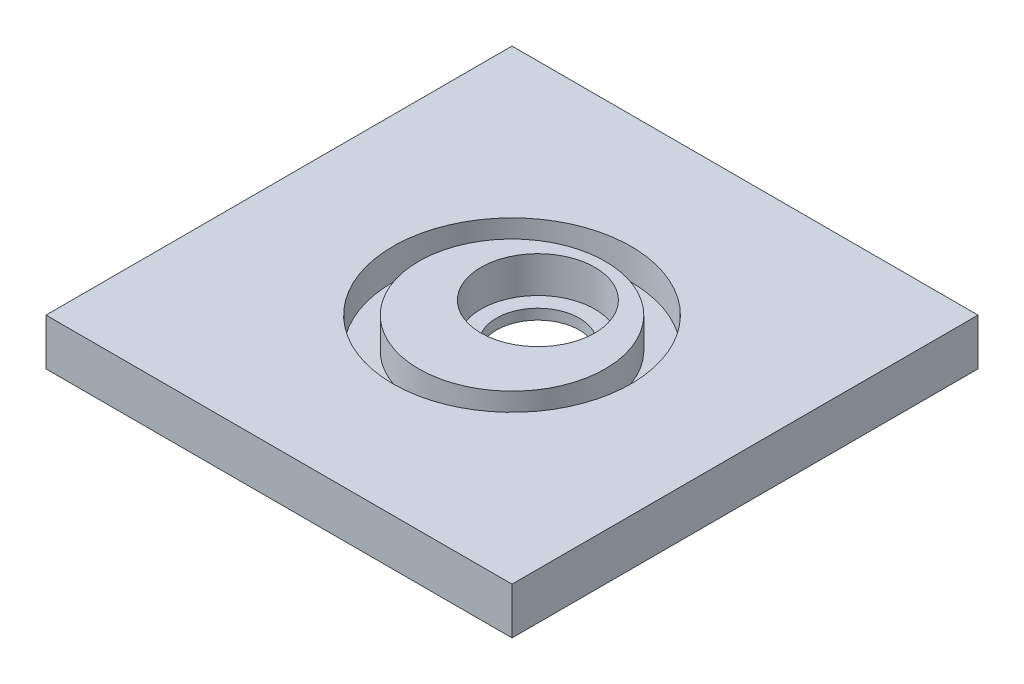
ISO-10303-21;
HEADER;
FILE_DESCRIPTION(('STEP AP214'),'2;1');
FILE_NAME('part.step','',(''),(''),'','','');
FILE_SCHEMA(('AUTOMOTIVE_DESIGN { 1 0 10303 214 1 1 1 1 }'));
ENDSEC;
DATA;
#1=APPLICATION_CONTEXT('core data for automotive mechanical design processes');
#2=APPLICATION_PROTOCOL_DEFINITION('international standard','automotive_design',2000,#1);
#3=PRODUCT_CONTEXT('',#1,'mechanical');
#4=PRODUCT('Part','Part','',(#3));
#5=PRODUCT_RELATED_PRODUCT_CATEGORY('part','',(#4));
#6=PRODUCT_DEFINITION_FORMATION('','',#4);
#7=PRODUCT_DEFINITION_CONTEXT('part definition',#1,'design');
#8=PRODUCT_DEFINITION('design','',#6,#7);
#9=PRODUCT_DEFINITION_SHAPE('','',#8);
#10=(LENGTH_UNIT() NAMED_UNIT(*) SI_UNIT(.MILLI.,.METRE.));
#11=(NAMED_UNIT(*) PLANE_ANGLE_UNIT() SI_UNIT($,.RADIAN.));
#12=(NAMED_UNIT(*) SI_UNIT($,.STERADIAN.) SOLID_ANGLE_UNIT());
#13=UNCERTAINTY_MEASURE_WITH_UNIT(LENGTH_MEASURE(1.E-05),#10,'distance_accuracy_value','');
#14=(GEOMETRIC_REPRESENTATION_CONTEXT(3) GLOBAL_UNCERTAINTY_ASSIGNED_CONTEXT((#13)) GLOBAL_UNIT_ASSIGNED_CONTEXT((#10,
#11,#12)) REPRESENTATION_CONTEXT('',''));
#15=CARTESIAN_POINT('',(0.,0.,0.));
#16=DIRECTION('',(0.,0.,1.));
#17=DIRECTION('',(1.,0.,0.));
#18=AXIS2_PLACEMENT_3D('',#15,#16,#17);
#19=CARTESIAN_POINT('',(0.,4.5,0.));
#20=DIRECTION('',(0.,-1.,0.));
#21=DIRECTION('',(0.,0.,-1.));
#22=AXIS2_PLACEMENT_3D('',#19,#20,#21);
#23=PLANE('',#22);
#24=CARTESIAN_POINT('',(0.,4.5,-2.5));
#25=DIRECTION('',(0.,1.,0.));
#26=DIRECTION('',(0.,0.,1.));
#27=AXIS2_PLACEMENT_3D('',#24,#25,#26);
#28=CIRCLE('',#27,5.5);
#29=CARTESIAN_POINT('',(0.,4.5,3.));
#30=VERTEX_POINT('',#29);
#31=EDGE_CURVE('E129',#30,#30,#28,.T.);
#32=ORIENTED_EDGE('',*,*,#31,.F.);
#33=EDGE_LOOP('',(#32));
#34=FACE_BOUND('',#33,.T.);
#35=CARTESIAN_POINT('',(0.,4.5,0.));
#36=DIRECTION('',(0.,1.,0.));
#37=DIRECTION('',(0.,0.,1.));
#38=AXIS2_PLACEMENT_3D('',#35,#36,#37);
#39=CIRCLE('',#38,9.);
#40=CARTESIAN_POINT('',(0.,4.5,9.));
#41=VERTEX_POINT('',#40);
#42=EDGE_CURVE('E153',#41,#41,#39,.T.);
#43=ORIENTED_EDGE('',*,*,#42,.T.);
#44=EDGE_LOOP('',(#43));
#45=FACE_BOUND('',#44,.T.);
#46=ADVANCED_FACE('F39',(#34,#45),#23,.F.);
#47=CARTESIAN_POINT('',(22.5,4.5,22.5));
#48=DIRECTION('',(-1.,0.,0.));
#49=DIRECTION('',(0.,0.,1.));
#50=AXIS2_PLACEMENT_3D('',#47,#48,#49);
#51=PLANE('',#50);
#52=DIRECTION('',(0.,0.,-1.));
#53=VECTOR('',#52,1.);
#54=CARTESIAN_POINT('',(22.5,0.,22.5));
#55=LINE('',#54,#53);
#56=CARTESIAN_POINT('',(22.5,0.,22.5));
#57=VERTEX_POINT('',#56);
#58=CARTESIAN_POINT('',(22.5,0.,-22.5));
#59=VERTEX_POINT('',#58);
#60=EDGE_CURVE('E108',#57,#59,#55,.T.);
#61=ORIENTED_EDGE('',*,*,#60,.T.);
#62=DIRECTION('',(0.,-1.,0.));
#63=VECTOR('',#62,1.);
#64=CARTESIAN_POINT('',(22.5,4.5,-22.5));
#65=LINE('',#64,#63);
#66=CARTESIAN_POINT('',(22.5,4.5,-22.5));
#67=VERTEX_POINT('',#66);
#68=EDGE_CURVE('E11',#67,#59,#65,.T.);
#69=ORIENTED_EDGE('',*,*,#68,.F.);
#70=DIRECTION('',(0.,0.,-1.));
#71=VECTOR('',#70,1.);
#72=CARTESIAN_POINT('',(22.5,4.5,22.5));
#73=LINE('',#72,#71);
#74=CARTESIAN_POINT('',(22.5,4.5,22.5));
#75=VERTEX_POINT('',#74);
#76=EDGE_CURVE('E92',#75,#67,#73,.T.);
#77=ORIENTED_EDGE('',*,*,#76,.F.);
#78=DIRECTION('',(0.,-1.,0.));
#79=VECTOR('',#78,1.);
#80=CARTESIAN_POINT('',(22.5,4.5,22.5));
#81=LINE('',#80,#79);
#82=EDGE_CURVE('E104',#75,#57,#81,.T.);
#83=ORIENTED_EDGE('',*,*,#82,.T.);
#84=EDGE_LOOP('',(#61,#69,#77,#83));
#85=FACE_BOUND('',#84,.T.);
#86=ADVANCED_FACE('F41',(#85),#51,.F.);
#87=CARTESIAN_POINT('',(-22.5,4.5,-22.5));
#88=DIRECTION('',(0.,0.,1.));
#89=DIRECTION('',(1.,0.,0.));
#90=AXIS2_PLACEMENT_3D('',#87,#88,#89);
#91=PLANE('',#90);
#92=DIRECTION('',(-1.,0.,0.));
#93=VECTOR('',#92,1.);
#94=CARTESIAN_POINT('',(-22.5,0.,-22.5));
#95=LINE('',#94,#93);
#96=CARTESIAN_POINT('',(-22.5,0.,-22.5));
#97=VERTEX_POINT('',#96);
#98=EDGE_CURVE('E97',#59,#97,#95,.T.);
#99=ORIENTED_EDGE('',*,*,#98,.T.);
#100=DIRECTION('',(0.,-1.,0.));
#101=VECTOR('',#100,1.);
#102=CARTESIAN_POINT('',(-22.5,4.5,-22.5));
#103=LINE('',#102,#101);
#104=CARTESIAN_POINT('',(-22.5,4.5,-22.5));
#105=VERTEX_POINT('',#104);
#106=EDGE_CURVE('E49',#105,#97,#103,.T.);
#107=ORIENTED_EDGE('',*,*,#106,.F.);
#108=DIRECTION('',(-1.,0.,0.));
#109=VECTOR('',#108,1.);
#110=CARTESIAN_POINT('',(-22.5,4.5,-22.5));
#111=LINE('',#110,#109);
#112=EDGE_CURVE('E87',#67,#105,#111,.T.);
#113=ORIENTED_EDGE('',*,*,#112,.F.);
#114=ORIENTED_EDGE('',*,*,#68,.T.);
#115=EDGE_LOOP('',(#99,#107,#113,#114));
#116=FACE_BOUND('',#115,.T.);
#117=ADVANCED_FACE('F96',(#116),#91,.F.);
#118=CARTESIAN_POINT('',(-22.5,4.5,22.5));
#119=DIRECTION('',(1.,0.,0.));
#120=DIRECTION('',(0.,0.,-1.));
#121=AXIS2_PLACEMENT_3D('',#118,#119,#120);
#122=PLANE('',#121);
#123=DIRECTION('',(0.,0.,1.));
#124=VECTOR('',#123,1.);
#125=CARTESIAN_POINT('',(-22.5,0.,22.5));
#126=LINE('',#125,#124);
#127=CARTESIAN_POINT('',(-22.5,0.,22.5));
#128=VERTEX_POINT('',#127);
#129=EDGE_CURVE('E74',#97,#128,#126,.T.);
#130=ORIENTED_EDGE('',*,*,#129,.T.);
#131=DIRECTION('',(0.,-1.,0.));
#132=VECTOR('',#131,1.);
#133=CARTESIAN_POINT('',(-22.5,4.5,22.5));
#134=LINE('',#133,#132);
#135=CARTESIAN_POINT('',(-22.5,4.5,22.5));
#136=VERTEX_POINT('',#135);
#137=EDGE_CURVE('E99',#136,#128,#134,.T.);
#138=ORIENTED_EDGE('',*,*,#137,.F.);
#139=DIRECTION('',(0.,0.,1.));
#140=VECTOR('',#139,1.);
#141=CARTESIAN_POINT('',(-22.5,4.5,22.5));
#142=LINE('',#141,#140);
#143=EDGE_CURVE('E90',#105,#136,#142,.T.);
#144=ORIENTED_EDGE('',*,*,#143,.F.);
#145=ORIENTED_EDGE('',*,*,#106,.T.);
#146=EDGE_LOOP('',(#130,#138,#144,#145));
#147=FACE_BOUND('',#146,.T.);
#148=ADVANCED_FACE('F100',(#147),#122,.F.);
#149=CARTESIAN_POINT('',(-22.5,4.5,22.5));
#150=DIRECTION('',(0.,0.,-1.));
#151=DIRECTION('',(-1.,0.,0.));
#152=AXIS2_PLACEMENT_3D('',#149,#150,#151);
#153=PLANE('',#152);
#154=DIRECTION('',(1.,0.,0.));
#155=VECTOR('',#154,1.);
#156=CARTESIAN_POINT('',(-22.5,0.,22.5));
#157=LINE('',#156,#155);
#158=EDGE_CURVE('E80',#128,#57,#157,.T.);
#159=ORIENTED_EDGE('',*,*,#158,.T.);
#160=ORIENTED_EDGE('',*,*,#82,.F.);
#161=DIRECTION('',(1.,0.,0.));
#162=VECTOR('',#161,1.);
#163=CARTESIAN_POINT('',(-22.5,4.5,22.5));
#164=LINE('',#163,#162);
#165=EDGE_CURVE('E57',#136,#75,#164,.T.);
#166=ORIENTED_EDGE('',*,*,#165,.F.);
#167=ORIENTED_EDGE('',*,*,#137,.T.);
#168=EDGE_LOOP('',(#159,#160,#166,#167));
#169=FACE_BOUND('',#168,.T.);
#170=ADVANCED_FACE('F122',(#169),#153,.F.);
#171=CARTESIAN_POINT('',(0.,4.5,0.));
#172=DIRECTION('',(0.,1.,0.));
#173=DIRECTION('',(0.,0.,1.));
#174=AXIS2_PLACEMENT_3D('',#171,#172,#173);
#175=CIRCLE('',#174,11.5);
#176=CARTESIAN_POINT('',(0.,4.5,11.5));
#177=VERTEX_POINT('',#176);
#178=EDGE_CURVE('E145',#177,#177,#175,.T.);
#179=ORIENTED_EDGE('',*,*,#178,.F.);
#180=EDGE_LOOP('',(#179));
#181=FACE_BOUND('',#180,.T.);
#182=ORIENTED_EDGE('',*,*,#76,.T.);
#183=ORIENTED_EDGE('',*,*,#112,.T.);
#184=ORIENTED_EDGE('',*,*,#143,.T.);
#185=ORIENTED_EDGE('',*,*,#165,.T.);
#186=EDGE_LOOP('',(#182,#183,#184,#185));
#187=FACE_BOUND('',#186,.T.);
#188=ADVANCED_FACE('F88',(#181,#187),#23,.F.);
#189=CARTESIAN_POINT('',(0.,0.,0.));
#190=DIRECTION('',(0.,-1.,0.));
#191=DIRECTION('',(0.,0.,-1.));
#192=AXIS2_PLACEMENT_3D('',#189,#190,#191);
#193=PLANE('',#192);
#194=CARTESIAN_POINT('',(0.,0.,-2.5));
#195=DIRECTION('',(0.,1.,0.));
#196=DIRECTION('',(0.,0.,1.));
#197=AXIS2_PLACEMENT_3D('',#194,#195,#196);
#198=CIRCLE('',#197,4.);
#199=CARTESIAN_POINT('',(0.,0.,1.5));
#200=VERTEX_POINT('',#199);
#201=EDGE_CURVE('E133',#200,#200,#198,.T.);
#202=ORIENTED_EDGE('',*,*,#201,.T.);
#203=EDGE_LOOP('',(#202));
#204=FACE_BOUND('',#203,.T.);
#205=ORIENTED_EDGE('',*,*,#60,.F.);
#206=ORIENTED_EDGE('',*,*,#158,.F.);
#207=ORIENTED_EDGE('',*,*,#129,.F.);
#208=ORIENTED_EDGE('',*,*,#98,.F.);
#209=EDGE_LOOP('',(#205,#206,#207,#208));
#210=FACE_BOUND('',#209,.T.);
#211=ADVANCED_FACE('F125',(#204,#210),#193,.T.);
#212=CARTESIAN_POINT('',(0.,1.,-2.5));
#213=DIRECTION('',(0.,1.,0.));
#214=DIRECTION('',(0.,0.,1.));
#215=AXIS2_PLACEMENT_3D('',#212,#213,#214);
#216=CYLINDRICAL_SURFACE('',#215,5.5);
#217=CARTESIAN_POINT('',(0.,1.,-2.5));
#218=DIRECTION('',(0.,1.,0.));
#219=DIRECTION('',(0.,0.,1.));
#220=AXIS2_PLACEMENT_3D('',#217,#218,#219);
#221=CIRCLE('',#220,5.5);
#222=CARTESIAN_POINT('',(0.,1.,3.));
#223=VERTEX_POINT('',#222);
#224=EDGE_CURVE('E112',#223,#223,#221,.T.);
#225=ORIENTED_EDGE('',*,*,#224,.F.);
#226=EDGE_LOOP('',(#225));
#227=FACE_BOUND('',#226,.T.);
#228=ORIENTED_EDGE('',*,*,#31,.T.);
#229=EDGE_LOOP('',(#228));
#230=FACE_BOUND('',#229,.T.);
#231=ADVANCED_FACE('F183',(#227,#230),#216,.F.);
#232=CARTESIAN_POINT('',(0.,1.,-2.5));
#233=DIRECTION('',(0.,1.,0.));
#234=DIRECTION('',(0.,0.,1.));
#235=AXIS2_PLACEMENT_3D('',#232,#233,#234);
#236=PLANE('',#235);
#237=CARTESIAN_POINT('',(0.,1.,-2.5));
#238=DIRECTION('',(0.,1.,0.));
#239=DIRECTION('',(0.,0.,1.));
#240=AXIS2_PLACEMENT_3D('',#237,#238,#239);
#241=CIRCLE('',#240,4.);
#242=CARTESIAN_POINT('',(0.,1.,1.5));
#243=VERTEX_POINT('',#242);
#244=EDGE_CURVE('E137',#243,#243,#241,.T.);
#245=ORIENTED_EDGE('',*,*,#244,.F.);
#246=EDGE_LOOP('',(#245));
#247=FACE_BOUND('',#246,.T.);
#248=ORIENTED_EDGE('',*,*,#224,.T.);
#249=EDGE_LOOP('',(#248));
#250=FACE_BOUND('',#249,.T.);
#251=ADVANCED_FACE('F203',(#247,#250),#236,.T.);
#252=CARTESIAN_POINT('',(0.,0.,-2.5));
#253=DIRECTION('',(0.,1.,0.));
#254=DIRECTION('',(0.,0.,1.));
#255=AXIS2_PLACEMENT_3D('',#252,#253,#254);
#256=CYLINDRICAL_SURFACE('',#255,4.);
#257=ORIENTED_EDGE('',*,*,#201,.F.);
#258=EDGE_LOOP('',(#257));
#259=FACE_BOUND('',#258,.T.);
#260=ORIENTED_EDGE('',*,*,#244,.T.);
#261=EDGE_LOOP('',(#260));
#262=FACE_BOUND('',#261,.T.);
#263=ADVANCED_FACE('F173',(#259,#262),#256,.F.);
#264=CARTESIAN_POINT('',(0.,1.5,0.));
#265=DIRECTION('',(0.,1.,0.));
#266=DIRECTION('',(0.,0.,1.));
#267=AXIS2_PLACEMENT_3D('',#264,#265,#266);
#268=CYLINDRICAL_SURFACE('',#267,11.5);
#269=CARTESIAN_POINT('',(0.,1.5,0.));
#270=DIRECTION('',(0.,1.,0.));
#271=DIRECTION('',(0.,0.,1.));
#272=AXIS2_PLACEMENT_3D('',#269,#270,#271);
#273=CIRCLE('',#272,11.5);
#274=CARTESIAN_POINT('',(0.,1.5,11.5));
#275=VERTEX_POINT('',#274);
#276=EDGE_CURVE('E141',#275,#275,#273,.T.);
#277=ORIENTED_EDGE('',*,*,#276,.F.);
#278=EDGE_LOOP('',(#277));
#279=FACE_BOUND('',#278,.T.);
#280=ORIENTED_EDGE('',*,*,#178,.T.);
#281=EDGE_LOOP('',(#280));
#282=FACE_BOUND('',#281,.T.);
#283=ADVANCED_FACE('F167',(#279,#282),#268,.F.);
#284=CARTESIAN_POINT('',(0.,1.5,0.));
#285=DIRECTION('',(0.,1.,0.));
#286=DIRECTION('',(0.,0.,1.));
#287=AXIS2_PLACEMENT_3D('',#284,#285,#286);
#288=PLANE('',#287);
#289=CARTESIAN_POINT('',(0.,1.5,0.));
#290=DIRECTION('',(0.,1.,0.));
#291=DIRECTION('',(0.,0.,1.));
#292=AXIS2_PLACEMENT_3D('',#289,#290,#291);
#293=CIRCLE('',#292,9.);
#294=CARTESIAN_POINT('',(0.,1.5,9.));
#295=VERTEX_POINT('',#294);
#296=EDGE_CURVE('E149',#295,#295,#293,.T.);
#297=ORIENTED_EDGE('',*,*,#296,.F.);
#298=EDGE_LOOP('',(#297));
#299=FACE_BOUND('',#298,.T.);
#300=ORIENTED_EDGE('',*,*,#276,.T.);
#301=EDGE_LOOP('',(#300));
#302=FACE_BOUND('',#301,.T.);
#303=ADVANCED_FACE('F164',(#299,#302),#288,.T.);
#304=CARTESIAN_POINT('',(0.,1.5,0.));
#305=DIRECTION('',(0.,1.,0.));
#306=DIRECTION('',(0.,0.,1.));
#307=AXIS2_PLACEMENT_3D('',#304,#305,#306);
#308=CYLINDRICAL_SURFACE('',#307,9.);
#309=ORIENTED_EDGE('',*,*,#296,.T.);
#310=EDGE_LOOP('',(#309));
#311=FACE_BOUND('',#310,.T.);
#312=ORIENTED_EDGE('',*,*,#42,.F.);
#313=EDGE_LOOP('',(#312));
#314=FACE_BOUND('',#313,.T.);
#315=ADVANCED_FACE('F161',(#311,#314),#308,.T.);
#316=CLOSED_SHELL('',(#46,#86,#117,#148,#170,#188,#211,#231,#251,#263,#283,#303,#315));
#317=MANIFOLD_SOLID_BREP('B2',#316);
#318=ADVANCED_BREP_SHAPE_REPRESENTATION('',(#18,#317),#14);
#319=SHAPE_DEFINITION_REPRESENTATION(#9,#318);
ENDSEC;
END-ISO-10303-21;
